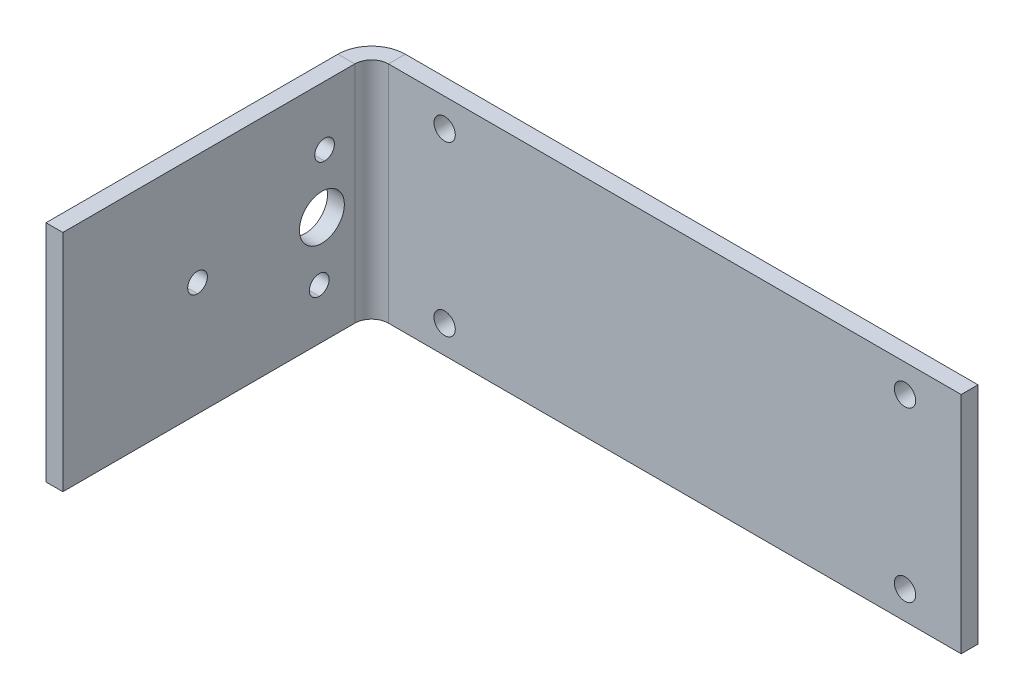
ISO-10303-21;
HEADER;
FILE_DESCRIPTION(('STEP AP214'),'2;1');
FILE_NAME('part.step','',(''),(''),'','','');
FILE_SCHEMA(('AUTOMOTIVE_DESIGN { 1 0 10303 214 1 1 1 1 }'));
ENDSEC;
DATA;
#1=APPLICATION_CONTEXT('core data for automotive mechanical design processes');
#2=APPLICATION_PROTOCOL_DEFINITION('international standard','automotive_design',2000,#1);
#3=PRODUCT_CONTEXT('',#1,'mechanical');
#4=PRODUCT('Part','Part','',(#3));
#5=PRODUCT_RELATED_PRODUCT_CATEGORY('part','',(#4));
#6=PRODUCT_DEFINITION_FORMATION('','',#4);
#7=PRODUCT_DEFINITION_CONTEXT('part definition',#1,'design');
#8=PRODUCT_DEFINITION('design','',#6,#7);
#9=PRODUCT_DEFINITION_SHAPE('','',#8);
#10=(LENGTH_UNIT() NAMED_UNIT(*) SI_UNIT(.MILLI.,.METRE.));
#11=(NAMED_UNIT(*) PLANE_ANGLE_UNIT() SI_UNIT($,.RADIAN.));
#12=(NAMED_UNIT(*) SI_UNIT($,.STERADIAN.) SOLID_ANGLE_UNIT());
#13=UNCERTAINTY_MEASURE_WITH_UNIT(LENGTH_MEASURE(1.E-05),#10,'distance_accuracy_value','');
#14=(GEOMETRIC_REPRESENTATION_CONTEXT(3) GLOBAL_UNCERTAINTY_ASSIGNED_CONTEXT((#13)) GLOBAL_UNIT_ASSIGNED_CONTEXT((#10,
#11,#12)) REPRESENTATION_CONTEXT('',''));
#15=CARTESIAN_POINT('',(0.,0.,0.));
#16=DIRECTION('',(0.,0.,1.));
#17=DIRECTION('',(1.,0.,0.));
#18=AXIS2_PLACEMENT_3D('',#15,#16,#17);
#19=CARTESIAN_POINT('',(-34.3611577667091,-15.3737113402062,-3.));
#20=DIRECTION('',(0.,-1.,0.));
#21=DIRECTION('',(0.,0.,-1.));
#22=AXIS2_PLACEMENT_3D('',#19,#20,#21);
#23=PLANE('',#22);
#24=DIRECTION('',(1.,0.,0.));
#25=VECTOR('',#24,1.);
#26=CARTESIAN_POINT('',(-34.3611577667091,-15.3737113402062,0.));
#27=LINE('',#26,#25);
#28=CARTESIAN_POINT('',(-31.3611577667091,-15.3737113402062,0.));
#29=VERTEX_POINT('',#28);
#30=CARTESIAN_POINT('',(70.6388422332909,-15.3737113402062,0.));
#31=VERTEX_POINT('',#30);
#32=EDGE_CURVE('E566',#29,#31,#27,.T.);
#33=ORIENTED_EDGE('',*,*,#32,.F.);
#34=DIRECTION('',(0.,0.,-1.));
#35=VECTOR('',#34,1.);
#36=CARTESIAN_POINT('',(-31.3611577667091,-15.3737113402062,0.));
#37=LINE('',#36,#35);
#38=CARTESIAN_POINT('',(-31.3611577667091,-15.3737113402062,-3.));
#39=VERTEX_POINT('',#38);
#40=EDGE_CURVE('E552',#29,#39,#37,.T.);
#41=ORIENTED_EDGE('',*,*,#40,.T.);
#42=DIRECTION('',(1.,0.,0.));
#43=VECTOR('',#42,1.);
#44=CARTESIAN_POINT('',(-34.3611577667091,-15.3737113402062,-3.));
#45=LINE('',#44,#43);
#46=CARTESIAN_POINT('',(70.6388422332909,-15.3737113402062,-3.));
#47=VERTEX_POINT('',#46);
#48=EDGE_CURVE('E569',#39,#47,#45,.T.);
#49=ORIENTED_EDGE('',*,*,#48,.T.);
#50=DIRECTION('',(0.,0.,1.));
#51=VECTOR('',#50,1.);
#52=CARTESIAN_POINT('',(70.6388422332909,-15.3737113402062,-3.));
#53=LINE('',#52,#51);
#54=EDGE_CURVE('E267',#47,#31,#53,.T.);
#55=ORIENTED_EDGE('',*,*,#54,.T.);
#56=EDGE_LOOP('',(#33,#41,#49,#55));
#57=FACE_BOUND('',#56,.T.);
#58=ADVANCED_FACE('F259',(#57),#23,.T.);
#59=CARTESIAN_POINT('',(0.,0.,-3.));
#60=DIRECTION('',(0.,0.,1.));
#61=DIRECTION('',(1.,0.,0.));
#62=AXIS2_PLACEMENT_3D('',#59,#60,#61);
#63=PLANE('',#62);
#64=CARTESIAN_POINT('',(60.6388422332909,19.6262886597938,-3.));
#65=DIRECTION('',(0.,0.,-1.));
#66=DIRECTION('',(-1.,0.,0.));
#67=AXIS2_PLACEMENT_3D('',#64,#65,#66);
#68=CIRCLE('',#67,1.89864999999999);
#69=CARTESIAN_POINT('',(58.7401922332909,19.6262886597938,-3.));
#70=VERTEX_POINT('',#69);
#71=EDGE_CURVE('E494',#70,#70,#68,.T.);
#72=ORIENTED_EDGE('',*,*,#71,.F.);
#73=EDGE_LOOP('',(#72));
#74=FACE_BOUND('',#73,.T.);
#75=CARTESIAN_POINT('',(60.6388422332909,-10.3737113402062,-3.));
#76=DIRECTION('',(0.,0.,-1.));
#77=DIRECTION('',(-1.,0.,0.));
#78=AXIS2_PLACEMENT_3D('',#75,#76,#77);
#79=CIRCLE('',#78,1.89864999999999);
#80=CARTESIAN_POINT('',(58.7401922332909,-10.3737113402062,-3.));
#81=VERTEX_POINT('',#80);
#82=EDGE_CURVE('E500',#81,#81,#79,.T.);
#83=ORIENTED_EDGE('',*,*,#82,.F.);
#84=EDGE_LOOP('',(#83));
#85=FACE_BOUND('',#84,.T.);
#86=CARTESIAN_POINT('',(-21.3611577667091,-10.3737113402062,-3.));
#87=DIRECTION('',(0.,0.,-1.));
#88=DIRECTION('',(-1.,0.,0.));
#89=AXIS2_PLACEMENT_3D('',#86,#87,#88);
#90=CIRCLE('',#89,1.89864999999999);
#91=CARTESIAN_POINT('',(-23.2598077667091,-10.3737113402062,-3.));
#92=VERTEX_POINT('',#91);
#93=EDGE_CURVE('E506',#92,#92,#90,.T.);
#94=ORIENTED_EDGE('',*,*,#93,.F.);
#95=EDGE_LOOP('',(#94));
#96=FACE_BOUND('',#95,.T.);
#97=CARTESIAN_POINT('',(-21.3611577667091,19.6262886597938,-3.));
#98=DIRECTION('',(0.,0.,-1.));
#99=DIRECTION('',(-1.,0.,0.));
#100=AXIS2_PLACEMENT_3D('',#97,#98,#99);
#101=CIRCLE('',#100,1.89864999999999);
#102=CARTESIAN_POINT('',(-23.2598077667091,19.6262886597938,-3.));
#103=VERTEX_POINT('',#102);
#104=EDGE_CURVE('E509',#103,#103,#101,.T.);
#105=ORIENTED_EDGE('',*,*,#104,.F.);
#106=EDGE_LOOP('',(#105));
#107=FACE_BOUND('',#106,.T.);
#108=DIRECTION('',(0.,-1.,0.));
#109=VECTOR('',#108,1.);
#110=CARTESIAN_POINT('',(-31.3611577667091,-15.3737113402062,-3.));
#111=LINE('',#110,#109);
#112=CARTESIAN_POINT('',(-31.3611577667091,24.6262886597938,-3.));
#113=VERTEX_POINT('',#112);
#114=EDGE_CURVE('E546',#39,#113,#111,.F.);
#115=ORIENTED_EDGE('',*,*,#114,.T.);
#116=DIRECTION('',(-1.,0.,0.));
#117=VECTOR('',#116,1.);
#118=CARTESIAN_POINT('',(-34.3611577667091,24.6262886597938,-3.));
#119=LINE('',#118,#117);
#120=CARTESIAN_POINT('',(70.6388422332909,24.6262886597938,-3.));
#121=VERTEX_POINT('',#120);
#122=EDGE_CURVE('E575',#121,#113,#119,.T.);
#123=ORIENTED_EDGE('',*,*,#122,.F.);
#124=DIRECTION('',(0.,1.,0.));
#125=VECTOR('',#124,1.);
#126=CARTESIAN_POINT('',(70.6388422332909,24.6262886597938,-3.));
#127=LINE('',#126,#125);
#128=EDGE_CURVE('E571',#47,#121,#127,.T.);
#129=ORIENTED_EDGE('',*,*,#128,.F.);
#130=ORIENTED_EDGE('',*,*,#48,.F.);
#131=EDGE_LOOP('',(#115,#123,#129,#130));
#132=FACE_BOUND('',#131,.T.);
#133=ADVANCED_FACE('F641',(#74,#85,#96,#107,#132),#63,.F.);
#134=CARTESIAN_POINT('',(0.,0.,0.));
#135=DIRECTION('',(0.,0.,1.));
#136=DIRECTION('',(1.,0.,0.));
#137=AXIS2_PLACEMENT_3D('',#134,#135,#136);
#138=PLANE('',#137);
#139=CARTESIAN_POINT('',(60.6388422332909,19.6262886597938,0.));
#140=DIRECTION('',(0.,0.,1.));
#141=DIRECTION('',(1.,0.,0.));
#142=AXIS2_PLACEMENT_3D('',#139,#140,#141);
#143=CIRCLE('',#142,1.89864999999999);
#144=CARTESIAN_POINT('',(62.5374922332909,19.6262886597938,0.));
#145=VERTEX_POINT('',#144);
#146=EDGE_CURVE('E497',#145,#145,#143,.T.);
#147=ORIENTED_EDGE('',*,*,#146,.F.);
#148=EDGE_LOOP('',(#147));
#149=FACE_BOUND('',#148,.T.);
#150=CARTESIAN_POINT('',(60.6388422332909,-10.3737113402062,0.));
#151=DIRECTION('',(0.,0.,1.));
#152=DIRECTION('',(1.,0.,0.));
#153=AXIS2_PLACEMENT_3D('',#150,#151,#152);
#154=CIRCLE('',#153,1.89864999999999);
#155=CARTESIAN_POINT('',(62.5374922332909,-10.3737113402062,0.));
#156=VERTEX_POINT('',#155);
#157=EDGE_CURVE('E503',#156,#156,#154,.T.);
#158=ORIENTED_EDGE('',*,*,#157,.F.);
#159=EDGE_LOOP('',(#158));
#160=FACE_BOUND('',#159,.T.);
#161=CARTESIAN_POINT('',(-21.3611577667091,-10.3737113402062,0.));
#162=DIRECTION('',(0.,0.,1.));
#163=DIRECTION('',(1.,0.,0.));
#164=AXIS2_PLACEMENT_3D('',#161,#162,#163);
#165=CIRCLE('',#164,1.89864999999999);
#166=CARTESIAN_POINT('',(-19.4625077667092,-10.3737113402062,0.));
#167=VERTEX_POINT('',#166);
#168=EDGE_CURVE('E262',#167,#167,#165,.T.);
#169=ORIENTED_EDGE('',*,*,#168,.F.);
#170=EDGE_LOOP('',(#169));
#171=FACE_BOUND('',#170,.T.);
#172=CARTESIAN_POINT('',(-21.3611577667091,19.6262886597938,0.));
#173=DIRECTION('',(0.,0.,1.));
#174=DIRECTION('',(1.,0.,0.));
#175=AXIS2_PLACEMENT_3D('',#172,#173,#174);
#176=CIRCLE('',#175,1.89864999999999);
#177=CARTESIAN_POINT('',(-19.4625077667092,19.6262886597938,0.));
#178=VERTEX_POINT('',#177);
#179=EDGE_CURVE('E512',#178,#178,#176,.T.);
#180=ORIENTED_EDGE('',*,*,#179,.F.);
#181=EDGE_LOOP('',(#180));
#182=FACE_BOUND('',#181,.T.);
#183=DIRECTION('',(-1.,0.,0.));
#184=VECTOR('',#183,1.);
#185=CARTESIAN_POINT('',(-34.3611577667091,24.6262886597938,0.));
#186=LINE('',#185,#184);
#187=CARTESIAN_POINT('',(70.6388422332909,24.6262886597938,0.));
#188=VERTEX_POINT('',#187);
#189=CARTESIAN_POINT('',(-31.3611577667091,24.6262886597938,0.));
#190=VERTEX_POINT('',#189);
#191=EDGE_CURVE('E572',#188,#190,#186,.T.);
#192=ORIENTED_EDGE('',*,*,#191,.T.);
#193=DIRECTION('',(0.,-1.,0.));
#194=VECTOR('',#193,1.);
#195=CARTESIAN_POINT('',(-31.3611577667091,-15.3737113402062,0.));
#196=LINE('',#195,#194);
#197=EDGE_CURVE('E558',#29,#190,#196,.F.);
#198=ORIENTED_EDGE('',*,*,#197,.F.);
#199=ORIENTED_EDGE('',*,*,#32,.T.);
#200=DIRECTION('',(0.,1.,0.));
#201=VECTOR('',#200,1.);
#202=CARTESIAN_POINT('',(70.6388422332909,24.6262886597938,0.));
#203=LINE('',#202,#201);
#204=EDGE_CURVE('E579',#31,#188,#203,.T.);
#205=ORIENTED_EDGE('',*,*,#204,.T.);
#206=EDGE_LOOP('',(#192,#198,#199,#205));
#207=FACE_BOUND('',#206,.T.);
#208=ADVANCED_FACE('F594',(#149,#160,#171,#182,#207),#138,.T.);
#209=CARTESIAN_POINT('',(-34.3611577667091,24.6262886597938,-3.));
#210=DIRECTION('',(0.,1.,0.));
#211=DIRECTION('',(0.,0.,1.));
#212=AXIS2_PLACEMENT_3D('',#209,#210,#211);
#213=PLANE('',#212);
#214=DIRECTION('',(0.,0.,-1.));
#215=VECTOR('',#214,1.);
#216=CARTESIAN_POINT('',(-31.3611577667091,24.6262886597938,0.));
#217=LINE('',#216,#215);
#218=EDGE_CURVE('E563',#190,#113,#217,.T.);
#219=ORIENTED_EDGE('',*,*,#218,.F.);
#220=ORIENTED_EDGE('',*,*,#191,.F.);
#221=DIRECTION('',(0.,0.,1.));
#222=VECTOR('',#221,1.);
#223=CARTESIAN_POINT('',(70.6388422332909,24.6262886597938,-3.));
#224=LINE('',#223,#222);
#225=EDGE_CURVE('E13',#121,#188,#224,.T.);
#226=ORIENTED_EDGE('',*,*,#225,.F.);
#227=ORIENTED_EDGE('',*,*,#122,.T.);
#228=EDGE_LOOP('',(#219,#220,#226,#227));
#229=FACE_BOUND('',#228,.T.);
#230=ADVANCED_FACE('F596',(#229),#213,.T.);
#231=CARTESIAN_POINT('',(70.6388422332909,24.6262886597938,-3.));
#232=DIRECTION('',(1.,0.,0.));
#233=DIRECTION('',(0.,1.,0.));
#234=AXIS2_PLACEMENT_3D('',#231,#232,#233);
#235=PLANE('',#234);
#236=ORIENTED_EDGE('',*,*,#204,.F.);
#237=ORIENTED_EDGE('',*,*,#54,.F.);
#238=ORIENTED_EDGE('',*,*,#128,.T.);
#239=ORIENTED_EDGE('',*,*,#225,.T.);
#240=EDGE_LOOP('',(#236,#237,#238,#239));
#241=FACE_BOUND('',#240,.T.);
#242=ADVANCED_FACE('F591',(#241),#235,.T.);
#243=CARTESIAN_POINT('',(-31.3611577667091,24.6262886597938,3.));
#244=DIRECTION('',(0.,1.,0.));
#245=DIRECTION('',(0.,0.,1.));
#246=AXIS2_PLACEMENT_3D('',#243,#244,#245);
#247=PLANE('',#246);
#248=DIRECTION('',(-1.,0.,0.));
#249=VECTOR('',#248,1.);
#250=CARTESIAN_POINT('',(-34.3611577667092,24.6262886597938,2.99999999999999));
#251=LINE('',#250,#249);
#252=CARTESIAN_POINT('',(-34.3611577667091,24.6262886597938,2.99999999999999));
#253=VERTEX_POINT('',#252);
#254=CARTESIAN_POINT('',(-37.3611577667092,24.6262886597938,2.99999999999998));
#255=VERTEX_POINT('',#254);
#256=EDGE_CURVE('E515',#253,#255,#251,.T.);
#257=ORIENTED_EDGE('',*,*,#256,.F.);
#258=CARTESIAN_POINT('',(-31.3611577667091,24.6262886597938,3.));
#259=DIRECTION('',(0.,-1.,0.));
#260=DIRECTION('',(0.,0.,-1.));
#261=AXIS2_PLACEMENT_3D('',#258,#259,#260);
#262=CIRCLE('',#261,3.);
#263=EDGE_CURVE('E555',#190,#253,#262,.F.);
#264=ORIENTED_EDGE('',*,*,#263,.F.);
#265=ORIENTED_EDGE('',*,*,#218,.T.);
#266=CARTESIAN_POINT('',(-31.3611577667091,24.6262886597938,3.));
#267=DIRECTION('',(0.,-1.,0.));
#268=DIRECTION('',(0.,0.,-1.));
#269=AXIS2_PLACEMENT_3D('',#266,#267,#268);
#270=CIRCLE('',#269,6.);
#271=EDGE_CURVE('E548',#113,#255,#270,.F.);
#272=ORIENTED_EDGE('',*,*,#271,.T.);
#273=EDGE_LOOP('',(#257,#264,#265,#272));
#274=FACE_BOUND('',#273,.T.);
#275=ADVANCED_FACE('F601',(#274),#247,.T.);
#276=CARTESIAN_POINT('',(-31.3611577667091,-15.3737113402062,3.));
#277=DIRECTION('',(0.,1.,0.));
#278=DIRECTION('',(0.,0.,1.));
#279=AXIS2_PLACEMENT_3D('',#276,#277,#278);
#280=PLANE('',#279);
#281=CARTESIAN_POINT('',(-31.3611577667091,-15.3737113402062,3.));
#282=DIRECTION('',(0.,-1.,0.));
#283=DIRECTION('',(0.,0.,-1.));
#284=AXIS2_PLACEMENT_3D('',#281,#282,#283);
#285=CIRCLE('',#284,3.);
#286=CARTESIAN_POINT('',(-34.3611577667091,-15.3737113402062,2.99999999999999));
#287=VERTEX_POINT('',#286);
#288=EDGE_CURVE('E545',#287,#29,#285,.T.);
#289=ORIENTED_EDGE('',*,*,#288,.F.);
#290=DIRECTION('',(-1.,0.,0.));
#291=VECTOR('',#290,1.);
#292=CARTESIAN_POINT('',(-34.3611577667091,-15.3737113402062,2.99999999999999));
#293=LINE('',#292,#291);
#294=CARTESIAN_POINT('',(-37.3611577667091,-15.3737113402062,2.99999999999998));
#295=VERTEX_POINT('',#294);
#296=EDGE_CURVE('E518',#287,#295,#293,.T.);
#297=ORIENTED_EDGE('',*,*,#296,.T.);
#298=CARTESIAN_POINT('',(-31.3611577667091,-15.3737113402062,3.));
#299=DIRECTION('',(0.,-1.,0.));
#300=DIRECTION('',(0.,0.,-1.));
#301=AXIS2_PLACEMENT_3D('',#298,#299,#300);
#302=CIRCLE('',#301,6.);
#303=EDGE_CURVE('E549',#295,#39,#302,.T.);
#304=ORIENTED_EDGE('',*,*,#303,.T.);
#305=ORIENTED_EDGE('',*,*,#40,.F.);
#306=EDGE_LOOP('',(#289,#297,#304,#305));
#307=FACE_BOUND('',#306,.T.);
#308=ADVANCED_FACE('F655',(#307),#280,.F.);
#309=CARTESIAN_POINT('',(-31.3611577667091,-15.3737113402062,3.));
#310=DIRECTION('',(0.,-1.,0.));
#311=DIRECTION('',(-1.,0.,0.));
#312=AXIS2_PLACEMENT_3D('',#309,#310,#311);
#313=CYLINDRICAL_SURFACE('',#312,6.);
#314=ORIENTED_EDGE('',*,*,#114,.F.);
#315=ORIENTED_EDGE('',*,*,#303,.F.);
#316=DIRECTION('',(0.,1.,0.));
#317=VECTOR('',#316,1.);
#318=CARTESIAN_POINT('',(-37.3611577667091,0.,2.99999999999998));
#319=LINE('',#318,#317);
#320=EDGE_CURVE('E521',#295,#255,#319,.T.);
#321=ORIENTED_EDGE('',*,*,#320,.T.);
#322=ORIENTED_EDGE('',*,*,#271,.F.);
#323=EDGE_LOOP('',(#314,#315,#321,#322));
#324=FACE_BOUND('',#323,.T.);
#325=ADVANCED_FACE('F604',(#324),#313,.T.);
#326=CARTESIAN_POINT('',(-31.3611577667091,-15.3737113402062,3.));
#327=DIRECTION('',(0.,-1.,0.));
#328=DIRECTION('',(-1.,0.,0.));
#329=AXIS2_PLACEMENT_3D('',#326,#327,#328);
#330=CYLINDRICAL_SURFACE('',#329,3.);
#331=ORIENTED_EDGE('',*,*,#197,.T.);
#332=ORIENTED_EDGE('',*,*,#263,.T.);
#333=DIRECTION('',(0.,-1.,0.));
#334=VECTOR('',#333,1.);
#335=CARTESIAN_POINT('',(-34.3611577667092,24.6262886597938,2.99999999999999));
#336=LINE('',#335,#334);
#337=EDGE_CURVE('E516',#253,#287,#336,.T.);
#338=ORIENTED_EDGE('',*,*,#337,.T.);
#339=ORIENTED_EDGE('',*,*,#288,.T.);
#340=EDGE_LOOP('',(#331,#332,#338,#339));
#341=FACE_BOUND('',#340,.T.);
#342=ADVANCED_FACE('F625',(#341),#330,.F.);
#343=CARTESIAN_POINT('',(-37.3611577667091,24.6262886597938,0.));
#344=DIRECTION('',(0.,-1.,0.));
#345=DIRECTION('',(1.,0.,0.));
#346=AXIS2_PLACEMENT_3D('',#343,#344,#345);
#347=PLANE('',#346);
#348=ORIENTED_EDGE('',*,*,#256,.T.);
#349=DIRECTION('',(0.,0.,-1.));
#350=VECTOR('',#349,1.);
#351=CARTESIAN_POINT('',(-37.3611577667091,24.6262886597938,0.));
#352=LINE('',#351,#350);
#353=CARTESIAN_POINT('',(-37.3611577667093,24.6262886597938,55.));
#354=VERTEX_POINT('',#353);
#355=EDGE_CURVE('E526',#354,#255,#352,.T.);
#356=ORIENTED_EDGE('',*,*,#355,.F.);
#357=DIRECTION('',(1.,0.,0.));
#358=VECTOR('',#357,1.);
#359=CARTESIAN_POINT('',(-37.3611577667093,24.6262886597938,55.));
#360=LINE('',#359,#358);
#361=CARTESIAN_POINT('',(-34.3611577667093,24.6262886597938,55.));
#362=VERTEX_POINT('',#361);
#363=EDGE_CURVE('E534',#354,#362,#360,.T.);
#364=ORIENTED_EDGE('',*,*,#363,.T.);
#365=DIRECTION('',(0.,0.,-1.));
#366=VECTOR('',#365,1.);
#367=CARTESIAN_POINT('',(-34.3611577667091,24.6262886597938,0.));
#368=LINE('',#367,#366);
#369=EDGE_CURVE('E525',#362,#253,#368,.T.);
#370=ORIENTED_EDGE('',*,*,#369,.T.);
#371=EDGE_LOOP('',(#348,#356,#364,#370));
#372=FACE_BOUND('',#371,.T.);
#373=ADVANCED_FACE('F622',(#372),#347,.F.);
#374=CARTESIAN_POINT('',(-37.3611577667093,-15.3737113402062,55.));
#375=DIRECTION('',(0.,1.,0.));
#376=DIRECTION('',(-1.,0.,0.));
#377=AXIS2_PLACEMENT_3D('',#374,#375,#376);
#378=PLANE('',#377);
#379=ORIENTED_EDGE('',*,*,#296,.F.);
#380=DIRECTION('',(0.,0.,1.));
#381=VECTOR('',#380,1.);
#382=CARTESIAN_POINT('',(-34.3611577667093,-15.3737113402062,55.));
#383=LINE('',#382,#381);
#384=CARTESIAN_POINT('',(-34.3611577667093,-15.3737113402062,55.));
#385=VERTEX_POINT('',#384);
#386=EDGE_CURVE('E537',#287,#385,#383,.T.);
#387=ORIENTED_EDGE('',*,*,#386,.T.);
#388=DIRECTION('',(1.,0.,0.));
#389=VECTOR('',#388,1.);
#390=CARTESIAN_POINT('',(-37.3611577667093,-15.3737113402062,55.));
#391=LINE('',#390,#389);
#392=CARTESIAN_POINT('',(-37.3611577667093,-15.3737113402062,55.));
#393=VERTEX_POINT('',#392);
#394=EDGE_CURVE('E542',#393,#385,#391,.T.);
#395=ORIENTED_EDGE('',*,*,#394,.F.);
#396=DIRECTION('',(0.,0.,1.));
#397=VECTOR('',#396,1.);
#398=CARTESIAN_POINT('',(-37.3611577667093,-15.3737113402062,55.));
#399=LINE('',#398,#397);
#400=EDGE_CURVE('E529',#295,#393,#399,.T.);
#401=ORIENTED_EDGE('',*,*,#400,.F.);
#402=EDGE_LOOP('',(#379,#387,#395,#401));
#403=FACE_BOUND('',#402,.T.);
#404=ADVANCED_FACE('F613',(#403),#378,.F.);
#405=CARTESIAN_POINT('',(-37.3611577667091,0.,-1.27521126930757E-13));
#406=DIRECTION('',(1.,0.,0.));
#407=DIRECTION('',(0.,0.,-1.));
#408=AXIS2_PLACEMENT_3D('',#405,#406,#407);
#409=PLANE('',#408);
#410=CARTESIAN_POINT('',(-37.3611577667092,3.88724004195325,8.86011282291858));
#411=DIRECTION('',(-1.,0.,0.));
#412=DIRECTION('',(0.,0.,1.));
#413=AXIS2_PLACEMENT_3D('',#410,#411,#412);
#414=CIRCLE('',#413,4.);
#415=CARTESIAN_POINT('',(-37.3611577667092,3.88724004195325,12.8601128229186));
#416=VERTEX_POINT('',#415);
#417=EDGE_CURVE('E987',#416,#416,#414,.T.);
#418=ORIENTED_EDGE('',*,*,#417,.F.);
#419=EDGE_LOOP('',(#418));
#420=FACE_BOUND('',#419,.T.);
#421=CARTESIAN_POINT('',(-37.3611577667092,14.0869357120228,8.38150717569321));
#422=DIRECTION('',(1.,0.,0.));
#423=DIRECTION('',(0.,0.,-1.));
#424=AXIS2_PLACEMENT_3D('',#421,#422,#423);
#425=CIRCLE('',#424,1.74999999999999);
#426=CARTESIAN_POINT('',(-37.3611577667092,12.3369360503065,8.3804190612623));
#427=VERTEX_POINT('',#426);
#428=CARTESIAN_POINT('',(-37.3611577667092,15.8369357120228,8.38259529033446));
#429=VERTEX_POINT('',#428);
#430=EDGE_CURVE('E275',#427,#429,#425,.T.);
#431=ORIENTED_EDGE('',*,*,#430,.T.);
#432=DIRECTION('',(0.,-0.000621779674969979,0.999999806694999));
#433=VECTOR('',#432,1.);
#434=CARTESIAN_POINT('',(-37.3611577667092,15.8369357120228,8.38259529033446));
#435=LINE('',#434,#433);
#436=CARTESIAN_POINT('',(-37.3611577667092,15.8369326031244,8.38759528936793));
#437=VERTEX_POINT('',#436);
#438=EDGE_CURVE('E980',#429,#437,#435,.T.);
#439=ORIENTED_EDGE('',*,*,#438,.T.);
#440=CARTESIAN_POINT('',(-37.3611577667092,14.0869326031244,8.38650717472668));
#441=DIRECTION('',(1.,0.,0.));
#442=DIRECTION('',(0.,0.,-1.));
#443=AXIS2_PLACEMENT_3D('',#440,#441,#442);
#444=CIRCLE('',#443,1.74999999999999);
#445=CARTESIAN_POINT('',(-37.3611577667092,12.3369329414081,8.38541906029577));
#446=VERTEX_POINT('',#445);
#447=EDGE_CURVE('E425',#437,#446,#444,.T.);
#448=ORIENTED_EDGE('',*,*,#447,.T.);
#449=DIRECTION('',(0.,-0.000621779674969979,0.999999806694999));
#450=VECTOR('',#449,1.);
#451=CARTESIAN_POINT('',(-37.3611577667092,12.3369360503065,8.3804190612623));
#452=LINE('',#451,#450);
#453=EDGE_CURVE('E408',#427,#446,#452,.T.);
#454=ORIENTED_EDGE('',*,*,#453,.F.);
#455=EDGE_LOOP('',(#431,#439,#448,#454));
#456=FACE_BOUND('',#455,.T.);
#457=CARTESIAN_POINT('',(-37.3611577667092,-6.3124525192179,9.33371847111035));
#458=DIRECTION('',(1.,0.,0.));
#459=DIRECTION('',(0.,0.,-1.));
#460=AXIS2_PLACEMENT_3D('',#457,#458,#459);
#461=CIRCLE('',#460,1.74999999999999);
#462=CARTESIAN_POINT('',(-37.3611577667092,-8.06245218093414,9.33263035667944));
#463=VERTEX_POINT('',#462);
#464=CARTESIAN_POINT('',(-37.3611577667092,-4.56245251921791,9.3348065857516));
#465=VERTEX_POINT('',#464);
#466=EDGE_CURVE('E444',#463,#465,#461,.T.);
#467=ORIENTED_EDGE('',*,*,#466,.T.);
#468=DIRECTION('',(0.,-0.000621779674969979,0.999999806694999));
#469=VECTOR('',#468,1.);
#470=CARTESIAN_POINT('',(-37.3611577667092,-4.56245251921791,9.3348065857516));
#471=LINE('',#470,#469);
#472=CARTESIAN_POINT('',(-37.3611577667092,-4.56245562811629,9.33980658478508));
#473=VERTEX_POINT('',#472);
#474=EDGE_CURVE('E433',#465,#473,#471,.T.);
#475=ORIENTED_EDGE('',*,*,#474,.T.);
#476=CARTESIAN_POINT('',(-37.3611577667092,-6.31245562811628,9.33871847014383));
#477=DIRECTION('',(1.,0.,0.));
#478=DIRECTION('',(0.,0.,-1.));
#479=AXIS2_PLACEMENT_3D('',#476,#477,#478);
#480=CIRCLE('',#479,1.74999999999999);
#481=CARTESIAN_POINT('',(-37.3611577667092,-8.06245528983252,9.33763035571291));
#482=VERTEX_POINT('',#481);
#483=EDGE_CURVE('E455',#473,#482,#480,.T.);
#484=ORIENTED_EDGE('',*,*,#483,.T.);
#485=DIRECTION('',(0.,-0.000621779674969979,0.999999806694999));
#486=VECTOR('',#485,1.);
#487=CARTESIAN_POINT('',(-37.3611577667092,-8.06245218093414,9.33263035667944));
#488=LINE('',#487,#486);
#489=EDGE_CURVE('E436',#463,#482,#488,.T.);
#490=ORIENTED_EDGE('',*,*,#489,.F.);
#491=EDGE_LOOP('',(#467,#475,#484,#490));
#492=FACE_BOUND('',#491,.T.);
#493=DIRECTION('',(0.,-0.000621779674969979,0.999999806694999));
#494=VECTOR('',#493,1.);
#495=CARTESIAN_POINT('',(-37.3611577667092,3.17117285620256,31.0066067063255));
#496=LINE('',#495,#494);
#497=CARTESIAN_POINT('',(-37.3611577667092,3.17117285620256,31.0066067063255));
#498=VERTEX_POINT('',#497);
#499=CARTESIAN_POINT('',(-37.3611577667092,3.17116974730419,31.0116067053589));
#500=VERTEX_POINT('',#499);
#501=EDGE_CURVE('E468',#498,#500,#496,.T.);
#502=ORIENTED_EDGE('',*,*,#501,.F.);
#503=CARTESIAN_POINT('',(-37.3611577667092,4.9211725179188,31.0076948207564));
#504=DIRECTION('',(1.,0.,0.));
#505=DIRECTION('',(0.,0.,-1.));
#506=AXIS2_PLACEMENT_3D('',#503,#504,#505);
#507=CIRCLE('',#506,1.74999999999999);
#508=CARTESIAN_POINT('',(-37.3611577667092,6.67117251791879,31.0087829353976));
#509=VERTEX_POINT('',#508);
#510=EDGE_CURVE('E476',#498,#509,#507,.T.);
#511=ORIENTED_EDGE('',*,*,#510,.T.);
#512=DIRECTION('',(0.,-0.000621779674969979,0.999999806694999));
#513=VECTOR('',#512,1.);
#514=CARTESIAN_POINT('',(-37.3611577667092,6.67117251791879,31.0087829353976));
#515=LINE('',#514,#513);
#516=CARTESIAN_POINT('',(-37.3611577667092,6.67116907073653,31.0137829344311));
#517=VERTEX_POINT('',#516);
#518=EDGE_CURVE('E465',#509,#517,#515,.T.);
#519=ORIENTED_EDGE('',*,*,#518,.T.);
#520=CARTESIAN_POINT('',(-37.3611577667092,4.92116940902042,31.0126948197898));
#521=DIRECTION('',(1.,0.,0.));
#522=DIRECTION('',(0.,0.,-1.));
#523=AXIS2_PLACEMENT_3D('',#520,#521,#522);
#524=CIRCLE('',#523,1.74999999999999);
#525=EDGE_CURVE('E486',#517,#500,#524,.T.);
#526=ORIENTED_EDGE('',*,*,#525,.T.);
#527=EDGE_LOOP('',(#502,#511,#519,#526));
#528=FACE_BOUND('',#527,.T.);
#529=ORIENTED_EDGE('',*,*,#320,.F.);
#530=ORIENTED_EDGE('',*,*,#400,.T.);
#531=DIRECTION('',(0.,1.,0.));
#532=VECTOR('',#531,1.);
#533=CARTESIAN_POINT('',(-37.3611577667093,24.6262886597938,55.));
#534=LINE('',#533,#532);
#535=EDGE_CURVE('E532',#393,#354,#534,.T.);
#536=ORIENTED_EDGE('',*,*,#535,.T.);
#537=ORIENTED_EDGE('',*,*,#355,.T.);
#538=EDGE_LOOP('',(#529,#530,#536,#537));
#539=FACE_BOUND('',#538,.T.);
#540=ADVANCED_FACE('F608',(#420,#456,#492,#528,#539),#409,.F.);
#541=CARTESIAN_POINT('',(-34.3611577667091,0.,-1.17046682914228E-13));
#542=DIRECTION('',(1.,0.,0.));
#543=DIRECTION('',(0.,0.,-1.));
#544=AXIS2_PLACEMENT_3D('',#541,#542,#543);
#545=PLANE('',#544);
#546=CARTESIAN_POINT('',(-34.3611577667092,3.88724004195325,8.86011282291859));
#547=DIRECTION('',(1.,0.,0.));
#548=DIRECTION('',(0.,0.,-1.));
#549=AXIS2_PLACEMENT_3D('',#546,#547,#548);
#550=CIRCLE('',#549,3.99999999999999);
#551=CARTESIAN_POINT('',(-34.3611577667092,3.88724004195325,4.8601128229186));
#552=VERTEX_POINT('',#551);
#553=EDGE_CURVE('E982',#552,#552,#550,.T.);
#554=ORIENTED_EDGE('',*,*,#553,.F.);
#555=EDGE_LOOP('',(#554));
#556=FACE_BOUND('',#555,.T.);
#557=CARTESIAN_POINT('',(-34.3611577667092,14.0869357120228,8.38150717569322));
#558=DIRECTION('',(1.,0.,0.));
#559=DIRECTION('',(0.,0.,-1.));
#560=AXIS2_PLACEMENT_3D('',#557,#558,#559);
#561=CIRCLE('',#560,1.74999999999999);
#562=CARTESIAN_POINT('',(-34.3611577667092,12.3369360503065,8.38041906126231));
#563=VERTEX_POINT('',#562);
#564=CARTESIAN_POINT('',(-34.3611577667092,15.836935373739,8.38259529012413));
#565=VERTEX_POINT('',#564);
#566=EDGE_CURVE('E407',#563,#565,#561,.T.);
#567=ORIENTED_EDGE('',*,*,#566,.F.);
#568=DIRECTION('',(0.,-0.000621779674969979,0.999999806694999));
#569=VECTOR('',#568,1.);
#570=CARTESIAN_POINT('',(-34.3611577667092,12.3369360503065,8.38041906126231));
#571=LINE('',#570,#569);
#572=CARTESIAN_POINT('',(-34.3611577667092,12.3369329414081,8.38541906029578));
#573=VERTEX_POINT('',#572);
#574=EDGE_CURVE('E398',#563,#573,#571,.T.);
#575=ORIENTED_EDGE('',*,*,#574,.T.);
#576=CARTESIAN_POINT('',(-34.3611577667092,14.0869326031244,8.38650717472669));
#577=DIRECTION('',(1.,0.,0.));
#578=DIRECTION('',(0.,0.,-1.));
#579=AXIS2_PLACEMENT_3D('',#576,#577,#578);
#580=CIRCLE('',#579,1.74999999999999);
#581=CARTESIAN_POINT('',(-34.3611577667092,15.8369322648407,8.38759528915761));
#582=VERTEX_POINT('',#581);
#583=EDGE_CURVE('E413',#582,#573,#580,.T.);
#584=ORIENTED_EDGE('',*,*,#583,.F.);
#585=DIRECTION('',(0.,-0.000621779674969979,0.999999806694999));
#586=VECTOR('',#585,1.);
#587=CARTESIAN_POINT('',(-34.3611577667092,15.8369353737391,8.38259529012413));
#588=LINE('',#587,#586);
#589=EDGE_CURVE('E418',#565,#582,#588,.T.);
#590=ORIENTED_EDGE('',*,*,#589,.F.);
#591=EDGE_LOOP('',(#567,#575,#584,#590));
#592=FACE_BOUND('',#591,.T.);
#593=CARTESIAN_POINT('',(-34.3611577667092,-6.3124525192179,9.33371847111036));
#594=DIRECTION('',(1.,0.,0.));
#595=DIRECTION('',(0.,0.,-1.));
#596=AXIS2_PLACEMENT_3D('',#593,#594,#595);
#597=CIRCLE('',#596,1.74999999999999);
#598=CARTESIAN_POINT('',(-34.3611577667092,-8.06245218093414,9.33263035667945));
#599=VERTEX_POINT('',#598);
#600=CARTESIAN_POINT('',(-34.3611577667092,-4.56245285750167,9.33480658554128));
#601=VERTEX_POINT('',#600);
#602=EDGE_CURVE('E441',#599,#601,#597,.T.);
#603=ORIENTED_EDGE('',*,*,#602,.F.);
#604=DIRECTION('',(0.,-0.000621779674969979,0.999999806694999));
#605=VECTOR('',#604,1.);
#606=CARTESIAN_POINT('',(-34.3611577667092,-8.06245218093414,9.33263035667945));
#607=LINE('',#606,#605);
#608=CARTESIAN_POINT('',(-34.3611577667092,-8.06245528983252,9.33763035571292));
#609=VERTEX_POINT('',#608);
#610=EDGE_CURVE('E438',#599,#609,#607,.T.);
#611=ORIENTED_EDGE('',*,*,#610,.T.);
#612=CARTESIAN_POINT('',(-34.3611577667092,-6.31245562811628,9.33871847014384));
#613=DIRECTION('',(1.,0.,0.));
#614=DIRECTION('',(0.,0.,-1.));
#615=AXIS2_PLACEMENT_3D('',#612,#613,#614);
#616=CIRCLE('',#615,1.74999999999999);
#617=CARTESIAN_POINT('',(-34.3611577667092,-4.56245596640004,9.33980658457475));
#618=VERTEX_POINT('',#617);
#619=EDGE_CURVE('E452',#618,#609,#616,.T.);
#620=ORIENTED_EDGE('',*,*,#619,.F.);
#621=DIRECTION('',(0.,-0.000621779674969979,0.999999806694999));
#622=VECTOR('',#621,1.);
#623=CARTESIAN_POINT('',(-34.3611577667092,-4.56245285750166,9.33480658554128));
#624=LINE('',#623,#622);
#625=EDGE_CURVE('E430',#601,#618,#624,.T.);
#626=ORIENTED_EDGE('',*,*,#625,.F.);
#627=EDGE_LOOP('',(#603,#611,#620,#626));
#628=FACE_BOUND('',#627,.T.);
#629=CARTESIAN_POINT('',(-34.3611577667092,4.9211725179188,31.0076948207564));
#630=DIRECTION('',(1.,0.,0.));
#631=DIRECTION('',(0.,0.,-1.));
#632=AXIS2_PLACEMENT_3D('',#629,#630,#631);
#633=CIRCLE('',#632,1.74999999999999);
#634=CARTESIAN_POINT('',(-34.3611577667092,3.17117285620256,31.0066067063255));
#635=VERTEX_POINT('',#634);
#636=CARTESIAN_POINT('',(-34.3611577667092,6.67117217963504,31.0087829351873));
#637=VERTEX_POINT('',#636);
#638=EDGE_CURVE('E473',#635,#637,#633,.T.);
#639=ORIENTED_EDGE('',*,*,#638,.F.);
#640=DIRECTION('',(0.,-0.000621779674969979,0.999999806694999));
#641=VECTOR('',#640,1.);
#642=CARTESIAN_POINT('',(-34.3611577667092,3.17117285620256,31.0066067063255));
#643=LINE('',#642,#641);
#644=CARTESIAN_POINT('',(-34.3611577667092,3.17116974730419,31.011606705359));
#645=VERTEX_POINT('',#644);
#646=EDGE_CURVE('E470',#635,#645,#643,.T.);
#647=ORIENTED_EDGE('',*,*,#646,.T.);
#648=CARTESIAN_POINT('',(-34.3611577667092,4.92116940902042,31.0126948197899));
#649=DIRECTION('',(1.,0.,0.));
#650=DIRECTION('',(0.,0.,-1.));
#651=AXIS2_PLACEMENT_3D('',#648,#649,#650);
#652=CIRCLE('',#651,1.74999999999999);
#653=CARTESIAN_POINT('',(-34.3611577667092,6.67116907073666,31.0137829342208));
#654=VERTEX_POINT('',#653);
#655=EDGE_CURVE('E483',#654,#645,#652,.T.);
#656=ORIENTED_EDGE('',*,*,#655,.F.);
#657=DIRECTION('',(0.,-0.000621779674969979,0.999999806694999));
#658=VECTOR('',#657,1.);
#659=CARTESIAN_POINT('',(-34.3611577667092,6.67117217963503,31.0087829351873));
#660=LINE('',#659,#658);
#661=EDGE_CURVE('E462',#637,#654,#660,.T.);
#662=ORIENTED_EDGE('',*,*,#661,.F.);
#663=EDGE_LOOP('',(#639,#647,#656,#662));
#664=FACE_BOUND('',#663,.T.);
#665=ORIENTED_EDGE('',*,*,#386,.F.);
#666=ORIENTED_EDGE('',*,*,#337,.F.);
#667=ORIENTED_EDGE('',*,*,#369,.F.);
#668=DIRECTION('',(0.,1.,0.));
#669=VECTOR('',#668,1.);
#670=CARTESIAN_POINT('',(-34.3611577667093,24.6262886597938,55.));
#671=LINE('',#670,#669);
#672=EDGE_CURVE('E530',#385,#362,#671,.T.);
#673=ORIENTED_EDGE('',*,*,#672,.F.);
#674=EDGE_LOOP('',(#665,#666,#667,#673));
#675=FACE_BOUND('',#674,.T.);
#676=ADVANCED_FACE('F416',(#556,#592,#628,#664,#675),#545,.T.);
#677=CARTESIAN_POINT('',(-37.3611577667093,24.6262886597938,55.));
#678=DIRECTION('',(0.,0.,-1.));
#679=DIRECTION('',(-1.,0.,0.));
#680=AXIS2_PLACEMENT_3D('',#677,#678,#679);
#681=PLANE('',#680);
#682=ORIENTED_EDGE('',*,*,#672,.T.);
#683=ORIENTED_EDGE('',*,*,#363,.F.);
#684=ORIENTED_EDGE('',*,*,#535,.F.);
#685=ORIENTED_EDGE('',*,*,#394,.T.);
#686=EDGE_LOOP('',(#682,#683,#684,#685));
#687=FACE_BOUND('',#686,.T.);
#688=ADVANCED_FACE('F619',(#687),#681,.F.);
#689=CARTESIAN_POINT('',(-21.3611577667091,19.6262886597938,-3.));
#690=DIRECTION('',(0.,0.,-1.));
#691=DIRECTION('',(-1.,0.,0.));
#692=AXIS2_PLACEMENT_3D('',#689,#690,#691);
#693=CYLINDRICAL_SURFACE('',#692,1.89864999999999);
#694=ORIENTED_EDGE('',*,*,#179,.T.);
#695=EDGE_LOOP('',(#694));
#696=FACE_BOUND('',#695,.T.);
#697=ORIENTED_EDGE('',*,*,#104,.T.);
#698=EDGE_LOOP('',(#697));
#699=FACE_BOUND('',#698,.T.);
#700=ADVANCED_FACE('F635',(#696,#699),#693,.F.);
#701=CARTESIAN_POINT('',(-21.3611577667091,-10.3737113402062,-3.));
#702=DIRECTION('',(0.,0.,-1.));
#703=DIRECTION('',(-1.,0.,0.));
#704=AXIS2_PLACEMENT_3D('',#701,#702,#703);
#705=CYLINDRICAL_SURFACE('',#704,1.89864999999999);
#706=ORIENTED_EDGE('',*,*,#168,.T.);
#707=EDGE_LOOP('',(#706));
#708=FACE_BOUND('',#707,.T.);
#709=ORIENTED_EDGE('',*,*,#93,.T.);
#710=EDGE_LOOP('',(#709));
#711=FACE_BOUND('',#710,.T.);
#712=ADVANCED_FACE('F809',(#708,#711),#705,.F.);
#713=CARTESIAN_POINT('',(60.6388422332909,-10.3737113402062,-3.));
#714=DIRECTION('',(0.,0.,-1.));
#715=DIRECTION('',(-1.,0.,0.));
#716=AXIS2_PLACEMENT_3D('',#713,#714,#715);
#717=CYLINDRICAL_SURFACE('',#716,1.89864999999999);
#718=ORIENTED_EDGE('',*,*,#157,.T.);
#719=EDGE_LOOP('',(#718));
#720=FACE_BOUND('',#719,.T.);
#721=ORIENTED_EDGE('',*,*,#82,.T.);
#722=EDGE_LOOP('',(#721));
#723=FACE_BOUND('',#722,.T.);
#724=ADVANCED_FACE('F801',(#720,#723),#717,.F.);
#725=CARTESIAN_POINT('',(60.6388422332909,19.6262886597938,-3.));
#726=DIRECTION('',(0.,0.,-1.));
#727=DIRECTION('',(-1.,0.,0.));
#728=AXIS2_PLACEMENT_3D('',#725,#726,#727);
#729=CYLINDRICAL_SURFACE('',#728,1.89864999999999);
#730=ORIENTED_EDGE('',*,*,#146,.T.);
#731=EDGE_LOOP('',(#730));
#732=FACE_BOUND('',#731,.T.);
#733=ORIENTED_EDGE('',*,*,#71,.T.);
#734=EDGE_LOOP('',(#733));
#735=FACE_BOUND('',#734,.T.);
#736=ADVANCED_FACE('F793',(#732,#735),#729,.F.);
#737=CARTESIAN_POINT('',(-34.3611577667092,4.92116940902042,31.0126948197899));
#738=DIRECTION('',(1.,0.,0.));
#739=DIRECTION('',(0.,0.,-1.));
#740=AXIS2_PLACEMENT_3D('',#737,#738,#739);
#741=CYLINDRICAL_SURFACE('',#740,1.74999999999999);
#742=ORIENTED_EDGE('',*,*,#655,.T.);
#743=DIRECTION('',(1.,0.,0.));
#744=VECTOR('',#743,1.);
#745=CARTESIAN_POINT('',(-34.3611577667092,3.17116974730419,31.011606705359));
#746=LINE('',#745,#744);
#747=EDGE_CURVE('E489',#500,#645,#746,.T.);
#748=ORIENTED_EDGE('',*,*,#747,.F.);
#749=ORIENTED_EDGE('',*,*,#525,.F.);
#750=DIRECTION('',(1.,0.,0.));
#751=VECTOR('',#750,1.);
#752=CARTESIAN_POINT('',(-34.3611577667092,6.67116907073666,31.0137829342208));
#753=LINE('',#752,#751);
#754=EDGE_CURVE('E491',#654,#517,#753,.F.);
#755=ORIENTED_EDGE('',*,*,#754,.F.);
#756=EDGE_LOOP('',(#742,#748,#749,#755));
#757=FACE_BOUND('',#756,.T.);
#758=ADVANCED_FACE('F785',(#757),#741,.F.);
#759=CARTESIAN_POINT('',(-34.3611577667092,4.9211725179188,31.0076948207564));
#760=DIRECTION('',(1.,0.,0.));
#761=DIRECTION('',(0.,0.,-1.));
#762=AXIS2_PLACEMENT_3D('',#759,#760,#761);
#763=CYLINDRICAL_SURFACE('',#762,1.74999999999999);
#764=ORIENTED_EDGE('',*,*,#638,.T.);
#765=DIRECTION('',(1.,0.,0.));
#766=VECTOR('',#765,1.);
#767=CARTESIAN_POINT('',(-34.3611577667092,6.67117217963504,31.0087829351873));
#768=LINE('',#767,#766);
#769=EDGE_CURVE('E479',#509,#637,#768,.T.);
#770=ORIENTED_EDGE('',*,*,#769,.F.);
#771=ORIENTED_EDGE('',*,*,#510,.F.);
#772=DIRECTION('',(1.,0.,0.));
#773=VECTOR('',#772,1.);
#774=CARTESIAN_POINT('',(-34.3611577667092,3.17117285620256,31.0066067063255));
#775=LINE('',#774,#773);
#776=EDGE_CURVE('E481',#635,#498,#775,.F.);
#777=ORIENTED_EDGE('',*,*,#776,.F.);
#778=EDGE_LOOP('',(#764,#770,#771,#777));
#779=FACE_BOUND('',#778,.T.);
#780=ADVANCED_FACE('F777',(#779),#763,.F.);
#781=CARTESIAN_POINT('',(-34.3611577667092,3.17117285620256,31.0066067063255));
#782=DIRECTION('',(0.,-0.999999806694999,-0.000621779674969979));
#783=DIRECTION('',(0.,0.000621779674969979,-0.999999806694999));
#784=AXIS2_PLACEMENT_3D('',#781,#782,#783);
#785=PLANE('',#784);
#786=ORIENTED_EDGE('',*,*,#747,.T.);
#787=ORIENTED_EDGE('',*,*,#646,.F.);
#788=ORIENTED_EDGE('',*,*,#776,.T.);
#789=ORIENTED_EDGE('',*,*,#501,.T.);
#790=EDGE_LOOP('',(#786,#787,#788,#789));
#791=FACE_BOUND('',#790,.T.);
#792=ADVANCED_FACE('F769',(#791),#785,.F.);
#793=CARTESIAN_POINT('',(-34.3611577667092,6.67117217963504,31.0087829351873));
#794=DIRECTION('',(0.,0.999999806694999,0.000621779674969979));
#795=DIRECTION('',(0.,-0.000621779674969979,0.999999806694999));
#796=AXIS2_PLACEMENT_3D('',#793,#794,#795);
#797=PLANE('',#796);
#798=ORIENTED_EDGE('',*,*,#754,.T.);
#799=ORIENTED_EDGE('',*,*,#518,.F.);
#800=ORIENTED_EDGE('',*,*,#769,.T.);
#801=ORIENTED_EDGE('',*,*,#661,.T.);
#802=EDGE_LOOP('',(#798,#799,#800,#801));
#803=FACE_BOUND('',#802,.T.);
#804=ADVANCED_FACE('F761',(#803),#797,.F.);
#805=CARTESIAN_POINT('',(-34.3611577667092,-6.31245562811628,9.33871847014384));
#806=DIRECTION('',(1.,0.,0.));
#807=DIRECTION('',(0.,0.,-1.));
#808=AXIS2_PLACEMENT_3D('',#805,#806,#807);
#809=CYLINDRICAL_SURFACE('',#808,1.74999999999999);
#810=ORIENTED_EDGE('',*,*,#619,.T.);
#811=DIRECTION('',(1.,0.,0.));
#812=VECTOR('',#811,1.);
#813=CARTESIAN_POINT('',(-34.3611577667092,-8.06245528983252,9.33763035571292));
#814=LINE('',#813,#812);
#815=EDGE_CURVE('E458',#482,#609,#814,.T.);
#816=ORIENTED_EDGE('',*,*,#815,.F.);
#817=ORIENTED_EDGE('',*,*,#483,.F.);
#818=DIRECTION('',(1.,0.,0.));
#819=VECTOR('',#818,1.);
#820=CARTESIAN_POINT('',(-34.3611577667092,-4.56245596640004,9.33980658457475));
#821=LINE('',#820,#819);
#822=EDGE_CURVE('E460',#618,#473,#821,.F.);
#823=ORIENTED_EDGE('',*,*,#822,.F.);
#824=EDGE_LOOP('',(#810,#816,#817,#823));
#825=FACE_BOUND('',#824,.T.);
#826=ADVANCED_FACE('F753',(#825),#809,.F.);
#827=CARTESIAN_POINT('',(-34.3611577667092,-6.3124525192179,9.33371847111036));
#828=DIRECTION('',(1.,0.,0.));
#829=DIRECTION('',(0.,0.,-1.));
#830=AXIS2_PLACEMENT_3D('',#827,#828,#829);
#831=CYLINDRICAL_SURFACE('',#830,1.74999999999999);
#832=ORIENTED_EDGE('',*,*,#602,.T.);
#833=DIRECTION('',(1.,0.,0.));
#834=VECTOR('',#833,1.);
#835=CARTESIAN_POINT('',(-34.3611577667092,-4.56245285750167,9.33480658554128));
#836=LINE('',#835,#834);
#837=EDGE_CURVE('E447',#465,#601,#836,.T.);
#838=ORIENTED_EDGE('',*,*,#837,.F.);
#839=ORIENTED_EDGE('',*,*,#466,.F.);
#840=DIRECTION('',(1.,0.,0.));
#841=VECTOR('',#840,1.);
#842=CARTESIAN_POINT('',(-34.3611577667092,-8.06245218093414,9.33263035667945));
#843=LINE('',#842,#841);
#844=EDGE_CURVE('E449',#599,#463,#843,.F.);
#845=ORIENTED_EDGE('',*,*,#844,.F.);
#846=EDGE_LOOP('',(#832,#838,#839,#845));
#847=FACE_BOUND('',#846,.T.);
#848=ADVANCED_FACE('F745',(#847),#831,.F.);
#849=CARTESIAN_POINT('',(-34.3611577667092,-8.06245218093414,9.33263035667945));
#850=DIRECTION('',(0.,-0.999999806694999,-0.000621779674969979));
#851=DIRECTION('',(0.,0.000621779674969979,-0.999999806694999));
#852=AXIS2_PLACEMENT_3D('',#849,#850,#851);
#853=PLANE('',#852);
#854=ORIENTED_EDGE('',*,*,#815,.T.);
#855=ORIENTED_EDGE('',*,*,#610,.F.);
#856=ORIENTED_EDGE('',*,*,#844,.T.);
#857=ORIENTED_EDGE('',*,*,#489,.T.);
#858=EDGE_LOOP('',(#854,#855,#856,#857));
#859=FACE_BOUND('',#858,.T.);
#860=ADVANCED_FACE('F737',(#859),#853,.F.);
#861=CARTESIAN_POINT('',(-34.3611577667092,-4.56245285750167,9.33480658554128));
#862=DIRECTION('',(0.,0.999999806694999,0.000621779674969979));
#863=DIRECTION('',(0.,-0.000621779674969979,0.999999806694999));
#864=AXIS2_PLACEMENT_3D('',#861,#862,#863);
#865=PLANE('',#864);
#866=ORIENTED_EDGE('',*,*,#822,.T.);
#867=ORIENTED_EDGE('',*,*,#474,.F.);
#868=ORIENTED_EDGE('',*,*,#837,.T.);
#869=ORIENTED_EDGE('',*,*,#625,.T.);
#870=EDGE_LOOP('',(#866,#867,#868,#869));
#871=FACE_BOUND('',#870,.T.);
#872=ADVANCED_FACE('F730',(#871),#865,.F.);
#873=CARTESIAN_POINT('',(-34.3611577667092,14.0869326031244,8.38650717472669));
#874=DIRECTION('',(1.,0.,0.));
#875=DIRECTION('',(0.,0.,-1.));
#876=AXIS2_PLACEMENT_3D('',#873,#874,#875);
#877=CYLINDRICAL_SURFACE('',#876,1.74999999999999);
#878=ORIENTED_EDGE('',*,*,#583,.T.);
#879=DIRECTION('',(1.,0.,0.));
#880=VECTOR('',#879,1.);
#881=CARTESIAN_POINT('',(-34.3611577667092,12.3369329414081,8.38541906029578));
#882=LINE('',#881,#880);
#883=EDGE_CURVE('E403',#446,#573,#882,.T.);
#884=ORIENTED_EDGE('',*,*,#883,.F.);
#885=ORIENTED_EDGE('',*,*,#447,.F.);
#886=DIRECTION('',(1.,0.,0.));
#887=VECTOR('',#886,1.);
#888=CARTESIAN_POINT('',(-34.3611577667092,15.8369322648406,8.38759528915761));
#889=LINE('',#888,#887);
#890=EDGE_CURVE('E283',#582,#437,#889,.F.);
#891=ORIENTED_EDGE('',*,*,#890,.F.);
#892=EDGE_LOOP('',(#878,#884,#885,#891));
#893=FACE_BOUND('',#892,.T.);
#894=ADVANCED_FACE('F723',(#893),#877,.F.);
#895=CARTESIAN_POINT('',(-34.3611577667092,14.0869357120228,8.38150717569322));
#896=DIRECTION('',(1.,0.,0.));
#897=DIRECTION('',(0.,0.,-1.));
#898=AXIS2_PLACEMENT_3D('',#895,#896,#897);
#899=CYLINDRICAL_SURFACE('',#898,1.74999999999999);
#900=ORIENTED_EDGE('',*,*,#566,.T.);
#901=DIRECTION('',(1.,0.,0.));
#902=VECTOR('',#901,1.);
#903=CARTESIAN_POINT('',(-34.3611577667092,15.836935373739,8.38259529012413));
#904=LINE('',#903,#902);
#905=EDGE_CURVE('E414',#429,#565,#904,.T.);
#906=ORIENTED_EDGE('',*,*,#905,.F.);
#907=ORIENTED_EDGE('',*,*,#430,.F.);
#908=DIRECTION('',(1.,0.,0.));
#909=VECTOR('',#908,1.);
#910=CARTESIAN_POINT('',(-34.3611577667092,12.3369360503065,8.38041906126231));
#911=LINE('',#910,#909);
#912=EDGE_CURVE('E400',#563,#427,#911,.F.);
#913=ORIENTED_EDGE('',*,*,#912,.F.);
#914=EDGE_LOOP('',(#900,#906,#907,#913));
#915=FACE_BOUND('',#914,.T.);
#916=ADVANCED_FACE('F411',(#915),#899,.F.);
#917=CARTESIAN_POINT('',(-34.3611577667092,12.3369360503065,8.38041906126231));
#918=DIRECTION('',(0.,-0.999999806694999,-0.000621779674969979));
#919=DIRECTION('',(0.,0.000621779674969979,-0.999999806694999));
#920=AXIS2_PLACEMENT_3D('',#917,#918,#919);
#921=PLANE('',#920);
#922=ORIENTED_EDGE('',*,*,#883,.T.);
#923=ORIENTED_EDGE('',*,*,#574,.F.);
#924=ORIENTED_EDGE('',*,*,#912,.T.);
#925=ORIENTED_EDGE('',*,*,#453,.T.);
#926=EDGE_LOOP('',(#922,#923,#924,#925));
#927=FACE_BOUND('',#926,.T.);
#928=ADVANCED_FACE('F399',(#927),#921,.F.);
#929=CARTESIAN_POINT('',(-34.3611577667092,15.836935373739,8.38259529012413));
#930=DIRECTION('',(0.,0.999999806694999,0.000621779674969979));
#931=DIRECTION('',(0.,-0.000621779674969979,0.999999806694999));
#932=AXIS2_PLACEMENT_3D('',#929,#930,#931);
#933=PLANE('',#932);
#934=ORIENTED_EDGE('',*,*,#890,.T.);
#935=ORIENTED_EDGE('',*,*,#438,.F.);
#936=ORIENTED_EDGE('',*,*,#905,.T.);
#937=ORIENTED_EDGE('',*,*,#589,.T.);
#938=EDGE_LOOP('',(#934,#935,#936,#937));
#939=FACE_BOUND('',#938,.T.);
#940=ADVANCED_FACE('F691',(#939),#933,.F.);
#941=CARTESIAN_POINT('',(-37.3611577667092,3.88724004195325,8.86011282291858));
#942=DIRECTION('',(-1.,0.,0.));
#943=DIRECTION('',(0.,0.,1.));
#944=AXIS2_PLACEMENT_3D('',#941,#942,#943);
#945=CYLINDRICAL_SURFACE('',#944,3.99999999999999);
#946=ORIENTED_EDGE('',*,*,#553,.T.);
#947=EDGE_LOOP('',(#946));
#948=FACE_BOUND('',#947,.T.);
#949=ORIENTED_EDGE('',*,*,#417,.T.);
#950=EDGE_LOOP('',(#949));
#951=FACE_BOUND('',#950,.T.);
#952=ADVANCED_FACE('F702',(#948,#951),#945,.F.);
#953=CLOSED_SHELL('',(#58,#133,#208,#230,#242,#275,#308,#325,#342,#373,#404,#540,#676,#688,#700,
#712,#724,#736,#758,#780,#792,#804,#826,#848,#860,#872,#894,#916,#928,#940,#952));
#954=MANIFOLD_SOLID_BREP('B2',#953);
#955=ADVANCED_BREP_SHAPE_REPRESENTATION('',(#18,#954),#14);
#956=SHAPE_DEFINITION_REPRESENTATION(#9,#955);
ENDSEC;
END-ISO-10303-21;
